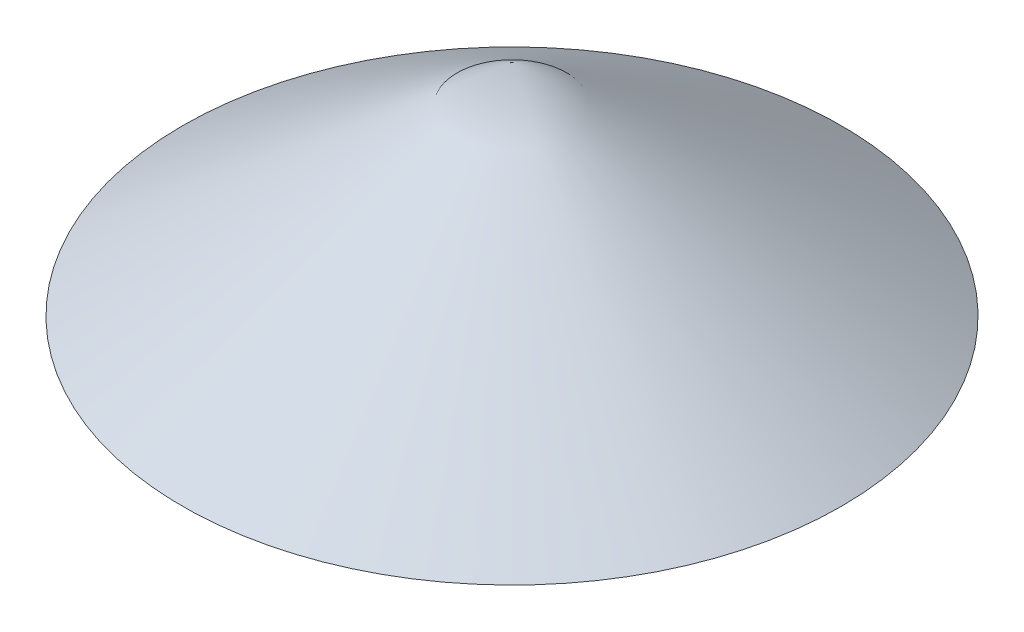
ISO-10303-21;
HEADER;
FILE_DESCRIPTION(('STEP AP214'),'2;1');
FILE_NAME('part.step','',(''),(''),'','','');
FILE_SCHEMA(('AUTOMOTIVE_DESIGN { 1 0 10303 214 1 1 1 1 }'));
ENDSEC;
DATA;
#1=APPLICATION_CONTEXT('core data for automotive mechanical design processes');
#2=APPLICATION_PROTOCOL_DEFINITION('international standard','automotive_design',2000,#1);
#3=PRODUCT_CONTEXT('',#1,'mechanical');
#4=PRODUCT('Part','Part','',(#3));
#5=PRODUCT_RELATED_PRODUCT_CATEGORY('part','',(#4));
#6=PRODUCT_DEFINITION_FORMATION('','',#4);
#7=PRODUCT_DEFINITION_CONTEXT('part definition',#1,'design');
#8=PRODUCT_DEFINITION('design','',#6,#7);
#9=PRODUCT_DEFINITION_SHAPE('','',#8);
#10=(LENGTH_UNIT() NAMED_UNIT(*) SI_UNIT(.MILLI.,.METRE.));
#11=(NAMED_UNIT(*) PLANE_ANGLE_UNIT() SI_UNIT($,.RADIAN.));
#12=(NAMED_UNIT(*) SI_UNIT($,.STERADIAN.) SOLID_ANGLE_UNIT());
#13=UNCERTAINTY_MEASURE_WITH_UNIT(LENGTH_MEASURE(1.E-05),#10,'distance_accuracy_value','');
#14=(GEOMETRIC_REPRESENTATION_CONTEXT(3) GLOBAL_UNCERTAINTY_ASSIGNED_CONTEXT((#13)) GLOBAL_UNIT_ASSIGNED_CONTEXT((#10,
#11,#12)) REPRESENTATION_CONTEXT('',''));
#15=CARTESIAN_POINT('',(0.,0.,0.));
#16=DIRECTION('',(0.,0.,1.));
#17=DIRECTION('',(1.,0.,0.));
#18=AXIS2_PLACEMENT_3D('',#15,#16,#17);
#19=CARTESIAN_POINT('',(0.,0.,0.));
#20=DIRECTION('',(0.,1.,0.));
#21=DIRECTION('',(-1.,0.,0.));
#22=AXIS2_PLACEMENT_3D('',#19,#20,#21);
#23=PLANE('',#22);
#24=CARTESIAN_POINT('',(0.,0.,0.));
#25=DIRECTION('',(0.,1.,0.));
#26=DIRECTION('',(-1.,0.,0.));
#27=AXIS2_PLACEMENT_3D('',#24,#25,#26);
#28=CIRCLE('',#27,30.);
#29=CARTESIAN_POINT('',(-30.,0.,0.));
#30=VERTEX_POINT('',#29);
#31=EDGE_CURVE('E11',#30,#30,#28,.T.);
#32=ORIENTED_EDGE('',*,*,#31,.F.);
#33=EDGE_LOOP('',(#32));
#34=FACE_BOUND('',#33,.T.);
#35=ADVANCED_FACE('F37',(#34),#23,.F.);
#36=CARTESIAN_POINT('',(0.,0.,0.));
#37=DIRECTION('',(0.,-1.,0.));
#38=DIRECTION('',(1.,0.,0.));
#39=AXIS2_PLACEMENT_3D('',#36,#37,#38);
#40=CONICAL_SURFACE('',#39,30.,0.982793723247329);
#41=CARTESIAN_POINT('',(0.,20.,0.));
#42=VERTEX_POINT('',#41);
#43=VERTEX_LOOP('',#42);
#44=FACE_BOUND('',#43,.T.);
#45=ORIENTED_EDGE('',*,*,#31,.T.);
#46=EDGE_LOOP('',(#45));
#47=FACE_BOUND('',#46,.T.);
#48=ADVANCED_FACE('F44',(#44,#47),#40,.T.);
#49=CLOSED_SHELL('',(#35,#48));
#50=MANIFOLD_SOLID_BREP('B2',#49);
#51=ADVANCED_BREP_SHAPE_REPRESENTATION('',(#18,#50),#14);
#52=SHAPE_DEFINITION_REPRESENTATION(#9,#51);
ENDSEC;
END-ISO-10303-21;
